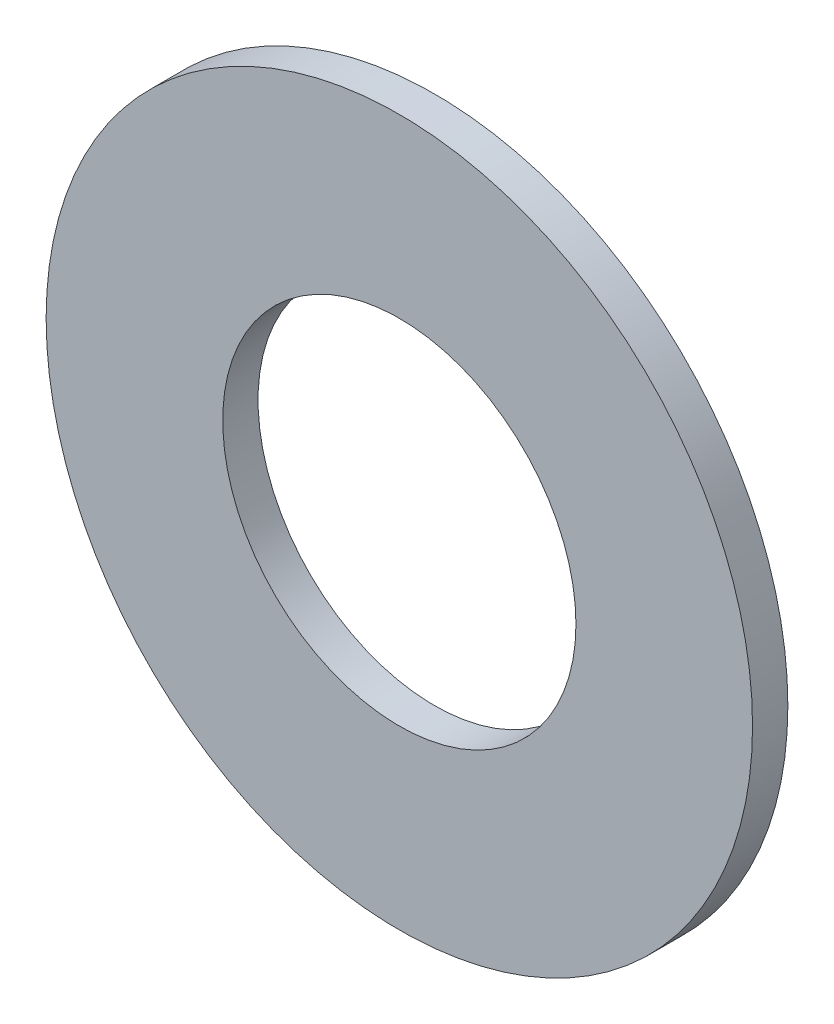
ISO-10303-21;
HEADER;
FILE_DESCRIPTION(('STEP AP214'),'2;1');
FILE_NAME('part.step','',(''),(''),'','','');
FILE_SCHEMA(('AUTOMOTIVE_DESIGN { 1 0 10303 214 1 1 1 1 }'));
ENDSEC;
DATA;
#1=APPLICATION_CONTEXT('core data for automotive mechanical design processes');
#2=APPLICATION_PROTOCOL_DEFINITION('international standard','automotive_design',2000,#1);
#3=PRODUCT_CONTEXT('',#1,'mechanical');
#4=PRODUCT('Part','Part','',(#3));
#5=PRODUCT_RELATED_PRODUCT_CATEGORY('part','',(#4));
#6=PRODUCT_DEFINITION_FORMATION('','',#4);
#7=PRODUCT_DEFINITION_CONTEXT('part definition',#1,'design');
#8=PRODUCT_DEFINITION('design','',#6,#7);
#9=PRODUCT_DEFINITION_SHAPE('','',#8);
#10=(LENGTH_UNIT() NAMED_UNIT(*) SI_UNIT(.MILLI.,.METRE.));
#11=(NAMED_UNIT(*) PLANE_ANGLE_UNIT() SI_UNIT($,.RADIAN.));
#12=(NAMED_UNIT(*) SI_UNIT($,.STERADIAN.) SOLID_ANGLE_UNIT());
#13=UNCERTAINTY_MEASURE_WITH_UNIT(LENGTH_MEASURE(1.E-05),#10,'distance_accuracy_value','');
#14=(GEOMETRIC_REPRESENTATION_CONTEXT(3) GLOBAL_UNCERTAINTY_ASSIGNED_CONTEXT((#13)) GLOBAL_UNIT_ASSIGNED_CONTEXT((#10,
#11,#12)) REPRESENTATION_CONTEXT('',''));
#15=CARTESIAN_POINT('',(0.,0.,0.));
#16=DIRECTION('',(0.,0.,1.));
#17=DIRECTION('',(1.,0.,0.));
#18=AXIS2_PLACEMENT_3D('',#15,#16,#17);
#19=CARTESIAN_POINT('',(0.,0.,0.5));
#20=DIRECTION('',(0.,0.,1.));
#21=DIRECTION('',(1.,0.,0.));
#22=AXIS2_PLACEMENT_3D('',#19,#20,#21);
#23=PLANE('',#22);
#24=CARTESIAN_POINT('',(0.,0.,0.5));
#25=DIRECTION('',(0.,0.,1.));
#26=DIRECTION('',(1.,0.,0.));
#27=AXIS2_PLACEMENT_3D('',#24,#25,#26);
#28=CIRCLE('',#27,5.);
#29=CARTESIAN_POINT('',(5.,0.,0.5));
#30=VERTEX_POINT('',#29);
#31=EDGE_CURVE('E10',#30,#30,#28,.T.);
#32=ORIENTED_EDGE('',*,*,#31,.T.);
#33=EDGE_LOOP('',(#32));
#34=FACE_BOUND('',#33,.T.);
#35=CARTESIAN_POINT('',(0.,0.,0.5));
#36=DIRECTION('',(0.,0.,1.));
#37=DIRECTION('',(1.,0.,0.));
#38=AXIS2_PLACEMENT_3D('',#35,#36,#37);
#39=CIRCLE('',#38,2.5);
#40=CARTESIAN_POINT('',(2.5,0.,0.5));
#41=VERTEX_POINT('',#40);
#42=EDGE_CURVE('E54',#41,#41,#39,.T.);
#43=ORIENTED_EDGE('',*,*,#42,.F.);
#44=EDGE_LOOP('',(#43));
#45=FACE_BOUND('',#44,.T.);
#46=ADVANCED_FACE('F41',(#34,#45),#23,.T.);
#47=CARTESIAN_POINT('',(0.,0.,0.));
#48=DIRECTION('',(0.,0.,1.));
#49=DIRECTION('',(1.,0.,0.));
#50=AXIS2_PLACEMENT_3D('',#47,#48,#49);
#51=PLANE('',#50);
#52=CARTESIAN_POINT('',(0.,0.,0.));
#53=DIRECTION('',(0.,0.,1.));
#54=DIRECTION('',(1.,0.,0.));
#55=AXIS2_PLACEMENT_3D('',#52,#53,#54);
#56=CIRCLE('',#55,5.);
#57=CARTESIAN_POINT('',(5.,0.,0.));
#58=VERTEX_POINT('',#57);
#59=EDGE_CURVE('E45',#58,#58,#56,.T.);
#60=ORIENTED_EDGE('',*,*,#59,.F.);
#61=EDGE_LOOP('',(#60));
#62=FACE_BOUND('',#61,.T.);
#63=CARTESIAN_POINT('',(0.,0.,0.));
#64=DIRECTION('',(0.,0.,1.));
#65=DIRECTION('',(1.,0.,0.));
#66=AXIS2_PLACEMENT_3D('',#63,#64,#65);
#67=CIRCLE('',#66,2.5);
#68=CARTESIAN_POINT('',(2.5,0.,0.));
#69=VERTEX_POINT('',#68);
#70=EDGE_CURVE('E56',#69,#69,#67,.T.);
#71=ORIENTED_EDGE('',*,*,#70,.T.);
#72=EDGE_LOOP('',(#71));
#73=FACE_BOUND('',#72,.T.);
#74=ADVANCED_FACE('F68',(#62,#73),#51,.F.);
#75=CARTESIAN_POINT('',(0.,0.,0.5));
#76=DIRECTION('',(0.,0.,-1.));
#77=DIRECTION('',(-1.,0.,0.));
#78=AXIS2_PLACEMENT_3D('',#75,#76,#77);
#79=CYLINDRICAL_SURFACE('',#78,5.);
#80=ORIENTED_EDGE('',*,*,#31,.F.);
#81=EDGE_LOOP('',(#80));
#82=FACE_BOUND('',#81,.T.);
#83=ORIENTED_EDGE('',*,*,#59,.T.);
#84=EDGE_LOOP('',(#83));
#85=FACE_BOUND('',#84,.T.);
#86=ADVANCED_FACE('F43',(#82,#85),#79,.T.);
#87=CARTESIAN_POINT('',(0.,0.,0.5));
#88=DIRECTION('',(0.,0.,-1.));
#89=DIRECTION('',(-1.,0.,0.));
#90=AXIS2_PLACEMENT_3D('',#87,#88,#89);
#91=CYLINDRICAL_SURFACE('',#90,2.5);
#92=ORIENTED_EDGE('',*,*,#42,.T.);
#93=EDGE_LOOP('',(#92));
#94=FACE_BOUND('',#93,.T.);
#95=ORIENTED_EDGE('',*,*,#70,.F.);
#96=EDGE_LOOP('',(#95));
#97=FACE_BOUND('',#96,.T.);
#98=ADVANCED_FACE('F64',(#94,#97),#91,.F.);
#99=CLOSED_SHELL('',(#46,#74,#86,#98));
#100=MANIFOLD_SOLID_BREP('B2',#99);
#101=ADVANCED_BREP_SHAPE_REPRESENTATION('',(#18,#100),#14);
#102=SHAPE_DEFINITION_REPRESENTATION(#9,#101);
ENDSEC;
END-ISO-10303-21;
